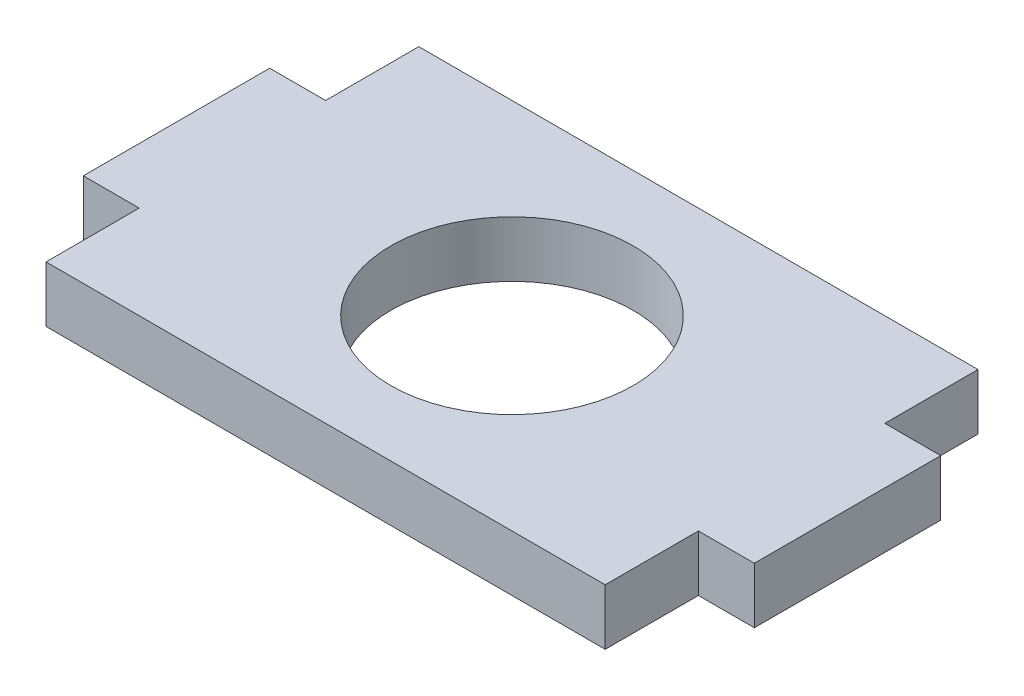
ISO-10303-21;
HEADER;
FILE_DESCRIPTION(('STEP AP214'),'2;1');
FILE_NAME('part.step','',(''),(''),'','','');
FILE_SCHEMA(('AUTOMOTIVE_DESIGN { 1 0 10303 214 1 1 1 1 }'));
ENDSEC;
DATA;
#1=APPLICATION_CONTEXT('core data for automotive mechanical design processes');
#2=APPLICATION_PROTOCOL_DEFINITION('international standard','automotive_design',2000,#1);
#3=PRODUCT_CONTEXT('',#1,'mechanical');
#4=PRODUCT('Part','Part','',(#3));
#5=PRODUCT_RELATED_PRODUCT_CATEGORY('part','',(#4));
#6=PRODUCT_DEFINITION_FORMATION('','',#4);
#7=PRODUCT_DEFINITION_CONTEXT('part definition',#1,'design');
#8=PRODUCT_DEFINITION('design','',#6,#7);
#9=PRODUCT_DEFINITION_SHAPE('','',#8);
#10=(LENGTH_UNIT() NAMED_UNIT(*) SI_UNIT(.MILLI.,.METRE.));
#11=(NAMED_UNIT(*) PLANE_ANGLE_UNIT() SI_UNIT($,.RADIAN.));
#12=(NAMED_UNIT(*) SI_UNIT($,.STERADIAN.) SOLID_ANGLE_UNIT());
#13=UNCERTAINTY_MEASURE_WITH_UNIT(LENGTH_MEASURE(1.E-05),#10,'distance_accuracy_value','');
#14=(GEOMETRIC_REPRESENTATION_CONTEXT(3) GLOBAL_UNCERTAINTY_ASSIGNED_CONTEXT((#13)) GLOBAL_UNIT_ASSIGNED_CONTEXT((#10,
#11,#12)) REPRESENTATION_CONTEXT('',''));
#15=CARTESIAN_POINT('',(0.,0.,0.));
#16=DIRECTION('',(0.,0.,1.));
#17=DIRECTION('',(1.,0.,0.));
#18=AXIS2_PLACEMENT_3D('',#15,#16,#17);
#19=CARTESIAN_POINT('',(0.,3.,0.));
#20=DIRECTION('',(0.,1.,0.));
#21=DIRECTION('',(0.,0.,1.));
#22=AXIS2_PLACEMENT_3D('',#19,#20,#21);
#23=PLANE('',#22);
#24=DIRECTION('',(-1.,0.,0.));
#25=VECTOR('',#24,1.);
#26=CARTESIAN_POINT('',(0.,3.,-5.));
#27=LINE('',#26,#25);
#28=CARTESIAN_POINT('',(3.,3.,-5.));
#29=VERTEX_POINT('',#28);
#30=CARTESIAN_POINT('',(0.,3.,-5.));
#31=VERTEX_POINT('',#30);
#32=EDGE_CURVE('E177',#29,#31,#27,.T.);
#33=ORIENTED_EDGE('',*,*,#32,.T.);
#34=DIRECTION('',(0.,0.,1.));
#35=VECTOR('',#34,1.);
#36=CARTESIAN_POINT('',(0.,3.,5.));
#37=LINE('',#36,#35);
#38=CARTESIAN_POINT('',(0.,3.,5.));
#39=VERTEX_POINT('',#38);
#40=EDGE_CURVE('E105',#31,#39,#37,.T.);
#41=ORIENTED_EDGE('',*,*,#40,.T.);
#42=DIRECTION('',(1.,0.,0.));
#43=VECTOR('',#42,1.);
#44=CARTESIAN_POINT('',(0.,3.,5.));
#45=LINE('',#44,#43);
#46=CARTESIAN_POINT('',(3.,3.,5.));
#47=VERTEX_POINT('',#46);
#48=EDGE_CURVE('E204',#39,#47,#45,.T.);
#49=ORIENTED_EDGE('',*,*,#48,.T.);
#50=DIRECTION('',(0.,0.,1.));
#51=VECTOR('',#50,1.);
#52=CARTESIAN_POINT('',(3.,3.,5.));
#53=LINE('',#52,#51);
#54=CARTESIAN_POINT('',(3.,3.,10.));
#55=VERTEX_POINT('',#54);
#56=EDGE_CURVE('E223',#47,#55,#53,.T.);
#57=ORIENTED_EDGE('',*,*,#56,.T.);
#58=DIRECTION('',(1.,0.,0.));
#59=VECTOR('',#58,1.);
#60=CARTESIAN_POINT('',(3.,3.,10.));
#61=LINE('',#60,#59);
#62=CARTESIAN_POINT('',(33.,3.,10.));
#63=VERTEX_POINT('',#62);
#64=EDGE_CURVE('E220',#55,#63,#61,.T.);
#65=ORIENTED_EDGE('',*,*,#64,.T.);
#66=DIRECTION('',(0.,0.,-1.));
#67=VECTOR('',#66,1.);
#68=CARTESIAN_POINT('',(33.,3.,5.));
#69=LINE('',#68,#67);
#70=CARTESIAN_POINT('',(33.,3.,5.));
#71=VERTEX_POINT('',#70);
#72=EDGE_CURVE('E222',#63,#71,#69,.T.);
#73=ORIENTED_EDGE('',*,*,#72,.T.);
#74=DIRECTION('',(1.,0.,0.));
#75=VECTOR('',#74,1.);
#76=CARTESIAN_POINT('',(36.,3.,5.));
#77=LINE('',#76,#75);
#78=CARTESIAN_POINT('',(36.,3.,5.));
#79=VERTEX_POINT('',#78);
#80=EDGE_CURVE('E225',#71,#79,#77,.T.);
#81=ORIENTED_EDGE('',*,*,#80,.T.);
#82=DIRECTION('',(0.,0.,-1.));
#83=VECTOR('',#82,1.);
#84=CARTESIAN_POINT('',(36.,3.,5.));
#85=LINE('',#84,#83);
#86=CARTESIAN_POINT('',(36.,3.,-5.));
#87=VERTEX_POINT('',#86);
#88=EDGE_CURVE('E231',#79,#87,#85,.T.);
#89=ORIENTED_EDGE('',*,*,#88,.T.);
#90=DIRECTION('',(-1.,0.,0.));
#91=VECTOR('',#90,1.);
#92=CARTESIAN_POINT('',(36.,3.,-5.));
#93=LINE('',#92,#91);
#94=CARTESIAN_POINT('',(33.,3.,-5.));
#95=VERTEX_POINT('',#94);
#96=EDGE_CURVE('E136',#87,#95,#93,.T.);
#97=ORIENTED_EDGE('',*,*,#96,.T.);
#98=DIRECTION('',(0.,0.,-1.));
#99=VECTOR('',#98,1.);
#100=CARTESIAN_POINT('',(33.,3.,-5.));
#101=LINE('',#100,#99);
#102=CARTESIAN_POINT('',(33.,3.,-10.));
#103=VERTEX_POINT('',#102);
#104=EDGE_CURVE('E130',#95,#103,#101,.T.);
#105=ORIENTED_EDGE('',*,*,#104,.T.);
#106=DIRECTION('',(-1.,0.,0.));
#107=VECTOR('',#106,1.);
#108=CARTESIAN_POINT('',(3.,3.,-10.));
#109=LINE('',#108,#107);
#110=CARTESIAN_POINT('',(3.,3.,-10.));
#111=VERTEX_POINT('',#110);
#112=EDGE_CURVE('E134',#103,#111,#109,.T.);
#113=ORIENTED_EDGE('',*,*,#112,.T.);
#114=DIRECTION('',(0.,0.,1.));
#115=VECTOR('',#114,1.);
#116=CARTESIAN_POINT('',(3.,3.,-5.));
#117=LINE('',#116,#115);
#118=EDGE_CURVE('E50',#111,#29,#117,.T.);
#119=ORIENTED_EDGE('',*,*,#118,.T.);
#120=EDGE_LOOP('',(#33,#41,#49,#57,#65,#73,#81,#89,#97,#105,#113,#119));
#121=FACE_BOUND('',#120,.T.);
#122=CARTESIAN_POINT('',(18.,3.,0.));
#123=DIRECTION('',(0.,1.,0.));
#124=DIRECTION('',(0.,0.,1.));
#125=AXIS2_PLACEMENT_3D('',#122,#123,#124);
#126=CIRCLE('',#125,6.5);
#127=CARTESIAN_POINT('',(18.,3.,6.5));
#128=VERTEX_POINT('',#127);
#129=EDGE_CURVE('E158',#128,#128,#126,.T.);
#130=ORIENTED_EDGE('',*,*,#129,.F.);
#131=EDGE_LOOP('',(#130));
#132=FACE_BOUND('',#131,.T.);
#133=ADVANCED_FACE('F33',(#121,#132),#23,.T.);
#134=CARTESIAN_POINT('',(0.,0.,0.));
#135=DIRECTION('',(0.,1.,0.));
#136=DIRECTION('',(0.,0.,1.));
#137=AXIS2_PLACEMENT_3D('',#134,#135,#136);
#138=PLANE('',#137);
#139=DIRECTION('',(-1.,0.,0.));
#140=VECTOR('',#139,1.);
#141=CARTESIAN_POINT('',(0.,0.,-5.));
#142=LINE('',#141,#140);
#143=CARTESIAN_POINT('',(3.,0.,-5.));
#144=VERTEX_POINT('',#143);
#145=CARTESIAN_POINT('',(0.,0.,-5.));
#146=VERTEX_POINT('',#145);
#147=EDGE_CURVE('E154',#144,#146,#142,.T.);
#148=ORIENTED_EDGE('',*,*,#147,.F.);
#149=DIRECTION('',(0.,0.,1.));
#150=VECTOR('',#149,1.);
#151=CARTESIAN_POINT('',(3.,0.,-5.));
#152=LINE('',#151,#150);
#153=CARTESIAN_POINT('',(3.,0.,-10.));
#154=VERTEX_POINT('',#153);
#155=EDGE_CURVE('E97',#154,#144,#152,.T.);
#156=ORIENTED_EDGE('',*,*,#155,.F.);
#157=DIRECTION('',(-1.,0.,0.));
#158=VECTOR('',#157,1.);
#159=CARTESIAN_POINT('',(3.,0.,-10.));
#160=LINE('',#159,#158);
#161=CARTESIAN_POINT('',(33.,0.,-10.));
#162=VERTEX_POINT('',#161);
#163=EDGE_CURVE('E91',#162,#154,#160,.T.);
#164=ORIENTED_EDGE('',*,*,#163,.F.);
#165=DIRECTION('',(0.,0.,-1.));
#166=VECTOR('',#165,1.);
#167=CARTESIAN_POINT('',(33.,0.,-5.));
#168=LINE('',#167,#166);
#169=CARTESIAN_POINT('',(33.,0.,-5.));
#170=VERTEX_POINT('',#169);
#171=EDGE_CURVE('E144',#170,#162,#168,.T.);
#172=ORIENTED_EDGE('',*,*,#171,.F.);
#173=DIRECTION('',(-1.,0.,0.));
#174=VECTOR('',#173,1.);
#175=CARTESIAN_POINT('',(36.,0.,-5.));
#176=LINE('',#175,#174);
#177=CARTESIAN_POINT('',(36.,0.,-5.));
#178=VERTEX_POINT('',#177);
#179=EDGE_CURVE('E172',#178,#170,#176,.T.);
#180=ORIENTED_EDGE('',*,*,#179,.F.);
#181=DIRECTION('',(0.,0.,-1.));
#182=VECTOR('',#181,1.);
#183=CARTESIAN_POINT('',(36.,0.,5.));
#184=LINE('',#183,#182);
#185=CARTESIAN_POINT('',(36.,0.,5.));
#186=VERTEX_POINT('',#185);
#187=EDGE_CURVE('E170',#186,#178,#184,.T.);
#188=ORIENTED_EDGE('',*,*,#187,.F.);
#189=DIRECTION('',(1.,0.,0.));
#190=VECTOR('',#189,1.);
#191=CARTESIAN_POINT('',(36.,0.,5.));
#192=LINE('',#191,#190);
#193=CARTESIAN_POINT('',(33.,0.,5.));
#194=VERTEX_POINT('',#193);
#195=EDGE_CURVE('E168',#194,#186,#192,.T.);
#196=ORIENTED_EDGE('',*,*,#195,.F.);
#197=DIRECTION('',(0.,0.,-1.));
#198=VECTOR('',#197,1.);
#199=CARTESIAN_POINT('',(33.,0.,5.));
#200=LINE('',#199,#198);
#201=CARTESIAN_POINT('',(33.,0.,10.));
#202=VERTEX_POINT('',#201);
#203=EDGE_CURVE('E166',#202,#194,#200,.T.);
#204=ORIENTED_EDGE('',*,*,#203,.F.);
#205=DIRECTION('',(1.,0.,0.));
#206=VECTOR('',#205,1.);
#207=CARTESIAN_POINT('',(3.,0.,10.));
#208=LINE('',#207,#206);
#209=CARTESIAN_POINT('',(3.,0.,10.));
#210=VERTEX_POINT('',#209);
#211=EDGE_CURVE('E164',#210,#202,#208,.T.);
#212=ORIENTED_EDGE('',*,*,#211,.F.);
#213=DIRECTION('',(0.,0.,1.));
#214=VECTOR('',#213,1.);
#215=CARTESIAN_POINT('',(3.,0.,5.));
#216=LINE('',#215,#214);
#217=CARTESIAN_POINT('',(3.,0.,5.));
#218=VERTEX_POINT('',#217);
#219=EDGE_CURVE('E162',#218,#210,#216,.T.);
#220=ORIENTED_EDGE('',*,*,#219,.F.);
#221=DIRECTION('',(1.,0.,0.));
#222=VECTOR('',#221,1.);
#223=CARTESIAN_POINT('',(0.,0.,5.));
#224=LINE('',#223,#222);
#225=CARTESIAN_POINT('',(0.,0.,5.));
#226=VERTEX_POINT('',#225);
#227=EDGE_CURVE('E160',#226,#218,#224,.T.);
#228=ORIENTED_EDGE('',*,*,#227,.F.);
#229=DIRECTION('',(0.,0.,1.));
#230=VECTOR('',#229,1.);
#231=CARTESIAN_POINT('',(0.,0.,5.));
#232=LINE('',#231,#230);
#233=EDGE_CURVE('E157',#146,#226,#232,.T.);
#234=ORIENTED_EDGE('',*,*,#233,.F.);
#235=EDGE_LOOP('',(#148,#156,#164,#172,#180,#188,#196,#204,#212,#220,#228,#234));
#236=FACE_BOUND('',#235,.T.);
#237=CARTESIAN_POINT('',(18.,0.,0.));
#238=DIRECTION('',(0.,1.,0.));
#239=DIRECTION('',(0.,0.,1.));
#240=AXIS2_PLACEMENT_3D('',#237,#238,#239);
#241=CIRCLE('',#240,6.5);
#242=CARTESIAN_POINT('',(18.,0.,6.5));
#243=VERTEX_POINT('',#242);
#244=EDGE_CURVE('E378',#243,#243,#241,.T.);
#245=ORIENTED_EDGE('',*,*,#244,.T.);
#246=EDGE_LOOP('',(#245));
#247=FACE_BOUND('',#246,.T.);
#248=ADVANCED_FACE('F208',(#236,#247),#138,.F.);
#249=CARTESIAN_POINT('',(0.,3.,-5.));
#250=DIRECTION('',(0.,0.,1.));
#251=DIRECTION('',(1.,0.,0.));
#252=AXIS2_PLACEMENT_3D('',#249,#250,#251);
#253=PLANE('',#252);
#254=ORIENTED_EDGE('',*,*,#147,.T.);
#255=DIRECTION('',(0.,-1.,0.));
#256=VECTOR('',#255,1.);
#257=CARTESIAN_POINT('',(0.,3.,-5.));
#258=LINE('',#257,#256);
#259=EDGE_CURVE('E11',#31,#146,#258,.T.);
#260=ORIENTED_EDGE('',*,*,#259,.F.);
#261=ORIENTED_EDGE('',*,*,#32,.F.);
#262=DIRECTION('',(0.,-1.,0.));
#263=VECTOR('',#262,1.);
#264=CARTESIAN_POINT('',(3.,3.,-5.));
#265=LINE('',#264,#263);
#266=EDGE_CURVE('E150',#29,#144,#265,.T.);
#267=ORIENTED_EDGE('',*,*,#266,.T.);
#268=EDGE_LOOP('',(#254,#260,#261,#267));
#269=FACE_BOUND('',#268,.T.);
#270=ADVANCED_FACE('F35',(#269),#253,.F.);
#271=CARTESIAN_POINT('',(0.,3.,5.));
#272=DIRECTION('',(1.,0.,0.));
#273=DIRECTION('',(0.,0.,-1.));
#274=AXIS2_PLACEMENT_3D('',#271,#272,#273);
#275=PLANE('',#274);
#276=ORIENTED_EDGE('',*,*,#233,.T.);
#277=DIRECTION('',(0.,-1.,0.));
#278=VECTOR('',#277,1.);
#279=CARTESIAN_POINT('',(0.,3.,5.));
#280=LINE('',#279,#278);
#281=EDGE_CURVE('E42',#39,#226,#280,.T.);
#282=ORIENTED_EDGE('',*,*,#281,.F.);
#283=ORIENTED_EDGE('',*,*,#40,.F.);
#284=ORIENTED_EDGE('',*,*,#259,.T.);
#285=EDGE_LOOP('',(#276,#282,#283,#284));
#286=FACE_BOUND('',#285,.T.);
#287=ADVANCED_FACE('F265',(#286),#275,.F.);
#288=CARTESIAN_POINT('',(0.,3.,5.));
#289=DIRECTION('',(0.,0.,-1.));
#290=DIRECTION('',(-1.,0.,0.));
#291=AXIS2_PLACEMENT_3D('',#288,#289,#290);
#292=PLANE('',#291);
#293=ORIENTED_EDGE('',*,*,#227,.T.);
#294=DIRECTION('',(0.,-1.,0.));
#295=VECTOR('',#294,1.);
#296=CARTESIAN_POINT('',(3.,3.,5.));
#297=LINE('',#296,#295);
#298=EDGE_CURVE('E196',#47,#218,#297,.T.);
#299=ORIENTED_EDGE('',*,*,#298,.F.);
#300=ORIENTED_EDGE('',*,*,#48,.F.);
#301=ORIENTED_EDGE('',*,*,#281,.T.);
#302=EDGE_LOOP('',(#293,#299,#300,#301));
#303=FACE_BOUND('',#302,.T.);
#304=ADVANCED_FACE('F202',(#303),#292,.F.);
#305=CARTESIAN_POINT('',(3.,3.,5.));
#306=DIRECTION('',(1.,0.,0.));
#307=DIRECTION('',(0.,0.,-1.));
#308=AXIS2_PLACEMENT_3D('',#305,#306,#307);
#309=PLANE('',#308);
#310=ORIENTED_EDGE('',*,*,#219,.T.);
#311=DIRECTION('',(0.,-1.,0.));
#312=VECTOR('',#311,1.);
#313=CARTESIAN_POINT('',(3.,3.,10.));
#314=LINE('',#313,#312);
#315=EDGE_CURVE('E193',#55,#210,#314,.T.);
#316=ORIENTED_EDGE('',*,*,#315,.F.);
#317=ORIENTED_EDGE('',*,*,#56,.F.);
#318=ORIENTED_EDGE('',*,*,#298,.T.);
#319=EDGE_LOOP('',(#310,#316,#317,#318));
#320=FACE_BOUND('',#319,.T.);
#321=ADVANCED_FACE('F214',(#320),#309,.F.);
#322=CARTESIAN_POINT('',(3.,3.,10.));
#323=DIRECTION('',(0.,0.,-1.));
#324=DIRECTION('',(-1.,0.,0.));
#325=AXIS2_PLACEMENT_3D('',#322,#323,#324);
#326=PLANE('',#325);
#327=ORIENTED_EDGE('',*,*,#211,.T.);
#328=DIRECTION('',(0.,-1.,0.));
#329=VECTOR('',#328,1.);
#330=CARTESIAN_POINT('',(33.,3.,10.));
#331=LINE('',#330,#329);
#332=EDGE_CURVE('E190',#63,#202,#331,.T.);
#333=ORIENTED_EDGE('',*,*,#332,.F.);
#334=ORIENTED_EDGE('',*,*,#64,.F.);
#335=ORIENTED_EDGE('',*,*,#315,.T.);
#336=EDGE_LOOP('',(#327,#333,#334,#335));
#337=FACE_BOUND('',#336,.T.);
#338=ADVANCED_FACE('F218',(#337),#326,.F.);
#339=CARTESIAN_POINT('',(33.,3.,5.));
#340=DIRECTION('',(-1.,0.,0.));
#341=DIRECTION('',(0.,0.,1.));
#342=AXIS2_PLACEMENT_3D('',#339,#340,#341);
#343=PLANE('',#342);
#344=ORIENTED_EDGE('',*,*,#203,.T.);
#345=DIRECTION('',(0.,-1.,0.));
#346=VECTOR('',#345,1.);
#347=CARTESIAN_POINT('',(33.,3.,5.));
#348=LINE('',#347,#346);
#349=EDGE_CURVE('E187',#71,#194,#348,.T.);
#350=ORIENTED_EDGE('',*,*,#349,.F.);
#351=ORIENTED_EDGE('',*,*,#72,.F.);
#352=ORIENTED_EDGE('',*,*,#332,.T.);
#353=EDGE_LOOP('',(#344,#350,#351,#352));
#354=FACE_BOUND('',#353,.T.);
#355=ADVANCED_FACE('F278',(#354),#343,.F.);
#356=CARTESIAN_POINT('',(36.,3.,5.));
#357=DIRECTION('',(0.,0.,-1.));
#358=DIRECTION('',(-1.,0.,0.));
#359=AXIS2_PLACEMENT_3D('',#356,#357,#358);
#360=PLANE('',#359);
#361=ORIENTED_EDGE('',*,*,#195,.T.);
#362=DIRECTION('',(0.,-1.,0.));
#363=VECTOR('',#362,1.);
#364=CARTESIAN_POINT('',(36.,3.,5.));
#365=LINE('',#364,#363);
#366=EDGE_CURVE('E184',#79,#186,#365,.T.);
#367=ORIENTED_EDGE('',*,*,#366,.F.);
#368=ORIENTED_EDGE('',*,*,#80,.F.);
#369=ORIENTED_EDGE('',*,*,#349,.T.);
#370=EDGE_LOOP('',(#361,#367,#368,#369));
#371=FACE_BOUND('',#370,.T.);
#372=ADVANCED_FACE('F281',(#371),#360,.F.);
#373=CARTESIAN_POINT('',(36.,3.,5.));
#374=DIRECTION('',(-1.,0.,0.));
#375=DIRECTION('',(0.,0.,1.));
#376=AXIS2_PLACEMENT_3D('',#373,#374,#375);
#377=PLANE('',#376);
#378=ORIENTED_EDGE('',*,*,#187,.T.);
#379=DIRECTION('',(0.,-1.,0.));
#380=VECTOR('',#379,1.);
#381=CARTESIAN_POINT('',(36.,3.,-5.));
#382=LINE('',#381,#380);
#383=EDGE_CURVE('E181',#87,#178,#382,.T.);
#384=ORIENTED_EDGE('',*,*,#383,.F.);
#385=ORIENTED_EDGE('',*,*,#88,.F.);
#386=ORIENTED_EDGE('',*,*,#366,.T.);
#387=EDGE_LOOP('',(#378,#384,#385,#386));
#388=FACE_BOUND('',#387,.T.);
#389=ADVANCED_FACE('F237',(#388),#377,.F.);
#390=CARTESIAN_POINT('',(36.,3.,-5.));
#391=DIRECTION('',(0.,0.,1.));
#392=DIRECTION('',(1.,0.,0.));
#393=AXIS2_PLACEMENT_3D('',#390,#391,#392);
#394=PLANE('',#393);
#395=ORIENTED_EDGE('',*,*,#179,.T.);
#396=DIRECTION('',(0.,-1.,0.));
#397=VECTOR('',#396,1.);
#398=CARTESIAN_POINT('',(33.,3.,-5.));
#399=LINE('',#398,#397);
#400=EDGE_CURVE('E145',#95,#170,#399,.T.);
#401=ORIENTED_EDGE('',*,*,#400,.F.);
#402=ORIENTED_EDGE('',*,*,#96,.F.);
#403=ORIENTED_EDGE('',*,*,#383,.T.);
#404=EDGE_LOOP('',(#395,#401,#402,#403));
#405=FACE_BOUND('',#404,.T.);
#406=ADVANCED_FACE('F241',(#405),#394,.F.);
#407=CARTESIAN_POINT('',(33.,3.,-5.));
#408=DIRECTION('',(-1.,0.,0.));
#409=DIRECTION('',(0.,0.,1.));
#410=AXIS2_PLACEMENT_3D('',#407,#408,#409);
#411=PLANE('',#410);
#412=ORIENTED_EDGE('',*,*,#171,.T.);
#413=DIRECTION('',(0.,-1.,0.));
#414=VECTOR('',#413,1.);
#415=CARTESIAN_POINT('',(33.,3.,-10.));
#416=LINE('',#415,#414);
#417=EDGE_CURVE('E141',#103,#162,#416,.T.);
#418=ORIENTED_EDGE('',*,*,#417,.F.);
#419=ORIENTED_EDGE('',*,*,#104,.F.);
#420=ORIENTED_EDGE('',*,*,#400,.T.);
#421=EDGE_LOOP('',(#412,#418,#419,#420));
#422=FACE_BOUND('',#421,.T.);
#423=ADVANCED_FACE('F142',(#422),#411,.F.);
#424=CARTESIAN_POINT('',(3.,3.,-10.));
#425=DIRECTION('',(0.,0.,1.));
#426=DIRECTION('',(1.,0.,0.));
#427=AXIS2_PLACEMENT_3D('',#424,#425,#426);
#428=PLANE('',#427);
#429=ORIENTED_EDGE('',*,*,#163,.T.);
#430=DIRECTION('',(0.,-1.,0.));
#431=VECTOR('',#430,1.);
#432=CARTESIAN_POINT('',(3.,3.,-10.));
#433=LINE('',#432,#431);
#434=EDGE_CURVE('E146',#111,#154,#433,.T.);
#435=ORIENTED_EDGE('',*,*,#434,.F.);
#436=ORIENTED_EDGE('',*,*,#112,.F.);
#437=ORIENTED_EDGE('',*,*,#417,.T.);
#438=EDGE_LOOP('',(#429,#435,#436,#437));
#439=FACE_BOUND('',#438,.T.);
#440=ADVANCED_FACE('F148',(#439),#428,.F.);
#441=CARTESIAN_POINT('',(3.,3.,-5.));
#442=DIRECTION('',(1.,0.,0.));
#443=DIRECTION('',(0.,0.,-1.));
#444=AXIS2_PLACEMENT_3D('',#441,#442,#443);
#445=PLANE('',#444);
#446=ORIENTED_EDGE('',*,*,#155,.T.);
#447=ORIENTED_EDGE('',*,*,#266,.F.);
#448=ORIENTED_EDGE('',*,*,#118,.F.);
#449=ORIENTED_EDGE('',*,*,#434,.T.);
#450=EDGE_LOOP('',(#446,#447,#448,#449));
#451=FACE_BOUND('',#450,.T.);
#452=ADVANCED_FACE('F245',(#451),#445,.F.);
#453=CARTESIAN_POINT('',(18.,3.,0.));
#454=DIRECTION('',(0.,-1.,0.));
#455=DIRECTION('',(0.,0.,-1.));
#456=AXIS2_PLACEMENT_3D('',#453,#454,#455);
#457=CYLINDRICAL_SURFACE('',#456,6.5);
#458=ORIENTED_EDGE('',*,*,#129,.T.);
#459=EDGE_LOOP('',(#458));
#460=FACE_BOUND('',#459,.T.);
#461=ORIENTED_EDGE('',*,*,#244,.F.);
#462=EDGE_LOOP('',(#461));
#463=FACE_BOUND('',#462,.T.);
#464=ADVANCED_FACE('F247',(#460,#463),#457,.F.);
#465=CLOSED_SHELL('',(#133,#248,#270,#287,#304,#321,#338,#355,#372,#389,#406,#423,#440,#452,#464));
#466=MANIFOLD_SOLID_BREP('B2',#465);
#467=ADVANCED_BREP_SHAPE_REPRESENTATION('',(#18,#466),#14);
#468=SHAPE_DEFINITION_REPRESENTATION(#9,#467);
ENDSEC;
END-ISO-10303-21;
